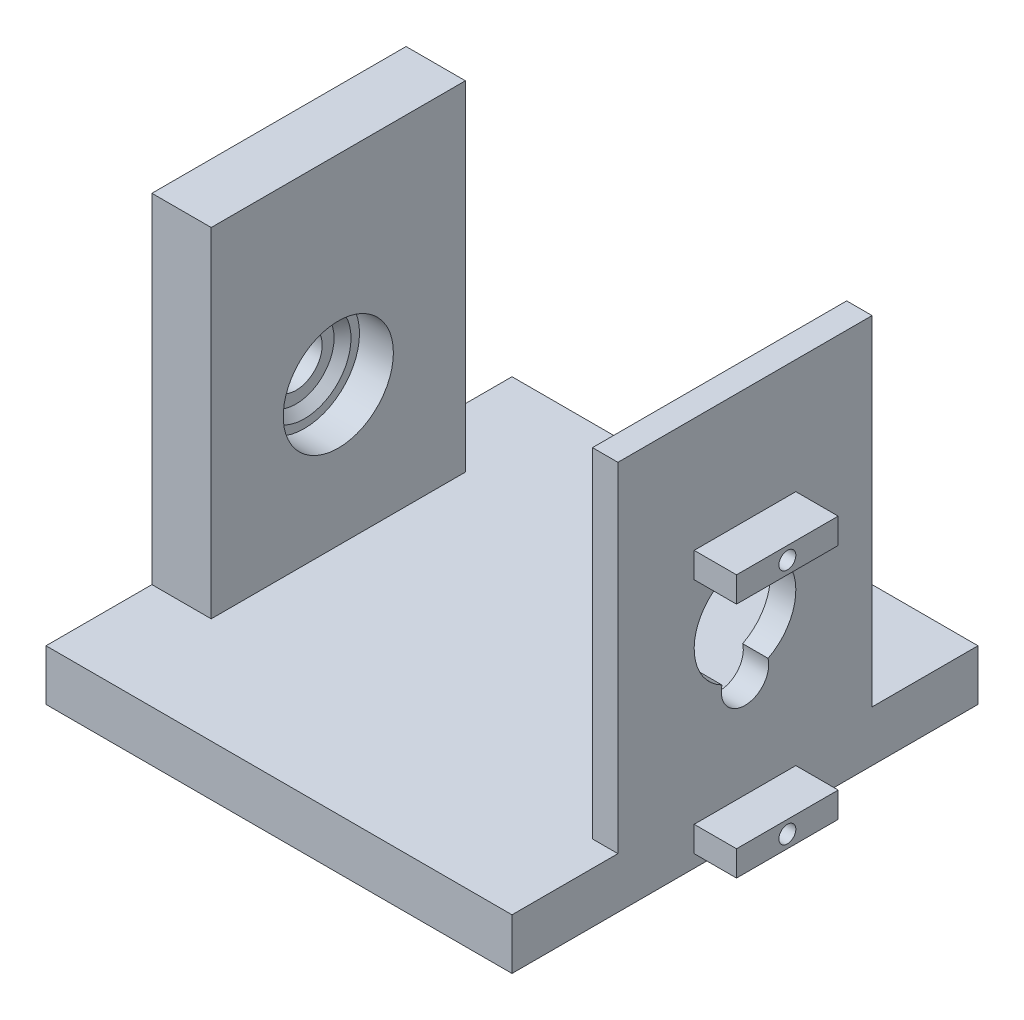
ISO-10303-21;
HEADER;
FILE_DESCRIPTION(('STEP AP214'),'2;1');
FILE_NAME('part.step','',(''),(''),'','','');
FILE_SCHEMA(('AUTOMOTIVE_DESIGN { 1 0 10303 214 1 1 1 1 }'));
ENDSEC;
DATA;
#1=APPLICATION_CONTEXT('core data for automotive mechanical design processes');
#2=APPLICATION_PROTOCOL_DEFINITION('international standard','automotive_design',2000,#1);
#3=PRODUCT_CONTEXT('',#1,'mechanical');
#4=PRODUCT('Part','Part','',(#3));
#5=PRODUCT_RELATED_PRODUCT_CATEGORY('part','',(#4));
#6=PRODUCT_DEFINITION_FORMATION('','',#4);
#7=PRODUCT_DEFINITION_CONTEXT('part definition',#1,'design');
#8=PRODUCT_DEFINITION('design','',#6,#7);
#9=PRODUCT_DEFINITION_SHAPE('','',#8);
#10=(LENGTH_UNIT() NAMED_UNIT(*) SI_UNIT(.MILLI.,.METRE.));
#11=(NAMED_UNIT(*) PLANE_ANGLE_UNIT() SI_UNIT($,.RADIAN.));
#12=(NAMED_UNIT(*) SI_UNIT($,.STERADIAN.) SOLID_ANGLE_UNIT());
#13=UNCERTAINTY_MEASURE_WITH_UNIT(LENGTH_MEASURE(1.E-05),#10,'distance_accuracy_value','');
#14=(GEOMETRIC_REPRESENTATION_CONTEXT(3) GLOBAL_UNCERTAINTY_ASSIGNED_CONTEXT((#13)) GLOBAL_UNIT_ASSIGNED_CONTEXT((#10,
#11,#12)) REPRESENTATION_CONTEXT('',''));
#15=CARTESIAN_POINT('',(0.,0.,0.));
#16=DIRECTION('',(0.,0.,1.));
#17=DIRECTION('',(1.,0.,0.));
#18=AXIS2_PLACEMENT_3D('',#15,#16,#17);
#19=CARTESIAN_POINT('',(-27.501,22.45,0.));
#20=DIRECTION('',(1.,0.,0.));
#21=DIRECTION('',(0.,0.,-1.));
#22=AXIS2_PLACEMENT_3D('',#19,#20,#21);
#23=CYLINDRICAL_SURFACE('',#22,3.1);
#24=CARTESIAN_POINT('',(-27.5,22.45,0.));
#25=DIRECTION('',(-1.,0.,0.));
#26=DIRECTION('',(0.,0.,1.));
#27=AXIS2_PLACEMENT_3D('',#24,#25,#26);
#28=CIRCLE('',#27,3.1);
#29=CARTESIAN_POINT('',(-27.5,22.45,-3.1));
#30=VERTEX_POINT('',#29);
#31=EDGE_CURVE('E219',#30,#30,#28,.F.);
#32=CARTESIAN_POINT('',(-25.5,22.45,0.));
#33=DIRECTION('',(1.,0.,0.));
#34=DIRECTION('',(0.,0.,-1.));
#35=AXIS2_PLACEMENT_3D('',#32,#33,#34);
#36=CIRCLE('',#35,3.1);
#37=CARTESIAN_POINT('',(-25.5,22.45,-3.1));
#38=VERTEX_POINT('',#37);
#39=EDGE_CURVE('E709',#38,#38,#36,.F.);
#40=CARTESIAN_POINT('',(-27.5,22.45,-3.1));
#41=CARTESIAN_POINT('',(-27.4791666666667,22.45,-3.1));
#42=CARTESIAN_POINT('',(-27.4583333333333,22.45,-3.1));
#43=CARTESIAN_POINT('',(-27.4166666666667,22.45,-3.1));
#44=CARTESIAN_POINT('',(-27.3958333333333,22.45,-3.1));
#45=CARTESIAN_POINT('',(-27.3541666666667,22.45,-3.1));
#46=CARTESIAN_POINT('',(-27.3333333333333,22.45,-3.1));
#47=CARTESIAN_POINT('',(-27.2916666666667,22.45,-3.1));
#48=CARTESIAN_POINT('',(-27.2708333333333,22.45,-3.1));
#49=CARTESIAN_POINT('',(-27.2291666666667,22.45,-3.1));
#50=CARTESIAN_POINT('',(-27.2083333333333,22.45,-3.1));
#51=CARTESIAN_POINT('',(-27.1666666666667,22.45,-3.1));
#52=CARTESIAN_POINT('',(-27.1458333333333,22.45,-3.1));
#53=CARTESIAN_POINT('',(-27.1041666666667,22.45,-3.1));
#54=CARTESIAN_POINT('',(-27.0833333333333,22.45,-3.1));
#55=CARTESIAN_POINT('',(-27.0416666666667,22.45,-3.1));
#56=CARTESIAN_POINT('',(-27.0208333333333,22.45,-3.1));
#57=CARTESIAN_POINT('',(-26.9791666666667,22.45,-3.1));
#58=CARTESIAN_POINT('',(-26.9583333333333,22.45,-3.1));
#59=CARTESIAN_POINT('',(-26.9166666666667,22.45,-3.1));
#60=CARTESIAN_POINT('',(-26.8958333333333,22.45,-3.1));
#61=CARTESIAN_POINT('',(-26.8541666666667,22.45,-3.1));
#62=CARTESIAN_POINT('',(-26.8333333333333,22.45,-3.1));
#63=CARTESIAN_POINT('',(-26.7916666666667,22.45,-3.1));
#64=CARTESIAN_POINT('',(-26.7708333333333,22.45,-3.1));
#65=CARTESIAN_POINT('',(-26.7291666666667,22.45,-3.1));
#66=CARTESIAN_POINT('',(-26.7083333333333,22.45,-3.1));
#67=CARTESIAN_POINT('',(-26.6666666666667,22.45,-3.1));
#68=CARTESIAN_POINT('',(-26.6458333333333,22.45,-3.1));
#69=CARTESIAN_POINT('',(-26.6041666666667,22.45,-3.1));
#70=CARTESIAN_POINT('',(-26.5833333333333,22.45,-3.1));
#71=CARTESIAN_POINT('',(-26.5416666666667,22.45,-3.1));
#72=CARTESIAN_POINT('',(-26.5208333333333,22.45,-3.1));
#73=CARTESIAN_POINT('',(-26.4791666666667,22.45,-3.1));
#74=CARTESIAN_POINT('',(-26.4583333333333,22.45,-3.1));
#75=CARTESIAN_POINT('',(-26.4166666666667,22.45,-3.1));
#76=CARTESIAN_POINT('',(-26.3958333333333,22.45,-3.1));
#77=CARTESIAN_POINT('',(-26.3541666666667,22.45,-3.1));
#78=CARTESIAN_POINT('',(-26.3333333333333,22.45,-3.1));
#79=CARTESIAN_POINT('',(-26.2916666666667,22.45,-3.1));
#80=CARTESIAN_POINT('',(-26.2708333333333,22.45,-3.1));
#81=CARTESIAN_POINT('',(-26.2291666666667,22.45,-3.1));
#82=CARTESIAN_POINT('',(-26.2083333333333,22.45,-3.1));
#83=CARTESIAN_POINT('',(-26.1666666666667,22.45,-3.1));
#84=CARTESIAN_POINT('',(-26.1458333333333,22.45,-3.1));
#85=CARTESIAN_POINT('',(-26.1041666666667,22.45,-3.1));
#86=CARTESIAN_POINT('',(-26.0833333333333,22.45,-3.1));
#87=CARTESIAN_POINT('',(-26.0416666666667,22.45,-3.1));
#88=CARTESIAN_POINT('',(-26.0208333333333,22.45,-3.1));
#89=CARTESIAN_POINT('',(-25.9791666666667,22.45,-3.1));
#90=CARTESIAN_POINT('',(-25.9583333333333,22.45,-3.1));
#91=CARTESIAN_POINT('',(-25.9166666666667,22.45,-3.1));
#92=CARTESIAN_POINT('',(-25.8958333333333,22.45,-3.1));
#93=CARTESIAN_POINT('',(-25.8541666666667,22.45,-3.1));
#94=CARTESIAN_POINT('',(-25.8333333333333,22.45,-3.1));
#95=CARTESIAN_POINT('',(-25.7916666666667,22.45,-3.1));
#96=CARTESIAN_POINT('',(-25.7708333333333,22.45,-3.1));
#97=CARTESIAN_POINT('',(-25.7291666666667,22.45,-3.1));
#98=CARTESIAN_POINT('',(-25.7083333333333,22.45,-3.1));
#99=CARTESIAN_POINT('',(-25.6666666666667,22.45,-3.1));
#100=CARTESIAN_POINT('',(-25.6458333333333,22.45,-3.1));
#101=CARTESIAN_POINT('',(-25.6041666666667,22.45,-3.1));
#102=CARTESIAN_POINT('',(-25.5833333333333,22.45,-3.1));
#103=CARTESIAN_POINT('',(-25.5416666666667,22.45,-3.1));
#104=CARTESIAN_POINT('',(-25.5208333333333,22.45,-3.1));
#105=CARTESIAN_POINT('',(-25.5,22.45,-3.1));
#106=B_SPLINE_CURVE_WITH_KNOTS('',3,(#40,#41,#42,#43,#44,#45,#46,#47,#48,#49,#50,#51,#52,#53,
#54,#55,#56,#57,#58,#59,#60,#61,#62,#63,#64,#65,#66,#67,#68,#69,#70,#71,#72,#73,#74,#75,#76,#77,
#78,#79,#80,#81,#82,#83,#84,#85,#86,#87,#88,#89,#90,#91,#92,#93,#94,#95,#96,#97,#98,#99,#100,
#101,#102,#103,#104,#105),.UNSPECIFIED.,.F.,.F.,(4,2,2,2,2,2,2,2,2,2,2,2,2,2,2,2,2,2,2,2,2,2,2,
2,2,2,2,2,2,2,2,2,4),(0.,0.0625000000000001,0.125,0.1875,0.25,0.3125,0.375,0.4375,0.5,0.5625,
0.625000000000001,0.687500000000001,0.750000000000001,0.812500000000001,0.875000000000001,
0.937500000000001,0.999999999999997,1.0625,1.125,1.1875,1.25,1.3125,1.375,1.4375,1.5,1.5625,
1.625,1.6875,1.75,1.8125,1.875,1.9375,1.99999999999999),.UNSPECIFIED.);
#107=EDGE_CURVE('BSEAM51',#30,#38,#106,.T.);
#108=ORIENTED_EDGE('',*,*,#31,.F.);
#109=ORIENTED_EDGE('',*,*,#39,.F.);
#110=ORIENTED_EDGE('',*,*,#107,.T.);
#111=ORIENTED_EDGE('',*,*,#107,.F.);
#112=EDGE_LOOP('',(#108,#110,#109,#111));
#113=FACE_BOUND('',#112,.T.);
#114=ADVANCED_FACE('F51',(#113),#23,.F.);
#115=CARTESIAN_POINT('',(27.5,6.,0.));
#116=DIRECTION('',(-1.,0.,0.));
#117=DIRECTION('',(0.,0.,1.));
#118=AXIS2_PLACEMENT_3D('',#115,#116,#117);
#119=PLANE('',#118);
#120=CARTESIAN_POINT('',(27.5,16.45,0.));
#121=DIRECTION('',(1.,0.,0.));
#122=DIRECTION('',(0.,0.,-1.));
#123=AXIS2_PLACEMENT_3D('',#120,#121,#122);
#124=CIRCLE('',#123,2.8);
#125=CARTESIAN_POINT('',(27.5,17.1033333333333,2.72271106721877));
#126=VERTEX_POINT('',#125);
#127=CARTESIAN_POINT('',(27.5,17.1033333333333,-2.72271106721877));
#128=VERTEX_POINT('',#127);
#129=EDGE_CURVE('E206',#126,#128,#124,.T.);
#130=ORIENTED_EDGE('',*,*,#129,.F.);
#131=CARTESIAN_POINT('',(27.5,22.45,0.));
#132=DIRECTION('',(1.,0.,0.));
#133=DIRECTION('',(0.,0.,-1.));
#134=AXIS2_PLACEMENT_3D('',#131,#132,#133);
#135=CIRCLE('',#134,6.);
#136=EDGE_CURVE('E70',#128,#126,#135,.T.);
#137=ORIENTED_EDGE('',*,*,#136,.F.);
#138=EDGE_LOOP('',(#130,#137));
#139=FACE_BOUND('',#138,.T.);
#140=DIRECTION('',(0.,0.,-1.));
#141=VECTOR('',#140,1.);
#142=CARTESIAN_POINT('',(27.5,29.5,0.));
#143=LINE('',#142,#141);
#144=CARTESIAN_POINT('',(27.5,29.5,6.));
#145=VERTEX_POINT('',#144);
#146=CARTESIAN_POINT('',(27.5,29.5,-6.));
#147=VERTEX_POINT('',#146);
#148=EDGE_CURVE('E302',#145,#147,#143,.T.);
#149=ORIENTED_EDGE('',*,*,#148,.F.);
#150=DIRECTION('',(0.,-1.,0.));
#151=VECTOR('',#150,1.);
#152=CARTESIAN_POINT('',(27.5,0.,5.99999999999998));
#153=LINE('',#152,#151);
#154=CARTESIAN_POINT('',(27.5,32.5,6.));
#155=VERTEX_POINT('',#154);
#156=EDGE_CURVE('E287',#155,#145,#153,.T.);
#157=ORIENTED_EDGE('',*,*,#156,.F.);
#158=DIRECTION('',(0.,0.,-1.));
#159=VECTOR('',#158,1.);
#160=CARTESIAN_POINT('',(27.5,32.5,0.));
#161=LINE('',#160,#159);
#162=CARTESIAN_POINT('',(27.5,32.5,-6.));
#163=VERTEX_POINT('',#162);
#164=EDGE_CURVE('E311',#155,#163,#161,.T.);
#165=ORIENTED_EDGE('',*,*,#164,.T.);
#166=DIRECTION('',(0.,-1.,0.));
#167=VECTOR('',#166,1.);
#168=CARTESIAN_POINT('',(27.5,0.,-6.00000000000002));
#169=LINE('',#168,#167);
#170=EDGE_CURVE('E310',#163,#147,#169,.T.);
#171=ORIENTED_EDGE('',*,*,#170,.T.);
#172=EDGE_LOOP('',(#149,#157,#165,#171));
#173=FACE_BOUND('',#172,.T.);
#174=DIRECTION('',(0.,0.,-1.));
#175=VECTOR('',#174,1.);
#176=CARTESIAN_POINT('',(27.5,0.,0.));
#177=LINE('',#176,#175);
#178=CARTESIAN_POINT('',(27.5,0.,27.5));
#179=VERTEX_POINT('',#178);
#180=CARTESIAN_POINT('',(27.5,0.,-27.5));
#181=VERTEX_POINT('',#180);
#182=EDGE_CURVE('E440',#179,#181,#177,.T.);
#183=ORIENTED_EDGE('',*,*,#182,.T.);
#184=DIRECTION('',(0.,-1.,0.));
#185=VECTOR('',#184,1.);
#186=CARTESIAN_POINT('',(27.5,6.,-27.5));
#187=LINE('',#186,#185);
#188=CARTESIAN_POINT('',(27.5,6.,-27.5));
#189=VERTEX_POINT('',#188);
#190=EDGE_CURVE('E455',#189,#181,#187,.T.);
#191=ORIENTED_EDGE('',*,*,#190,.F.);
#192=DIRECTION('',(0.,0.,-1.));
#193=VECTOR('',#192,1.);
#194=CARTESIAN_POINT('',(27.5,6.,0.));
#195=LINE('',#194,#193);
#196=CARTESIAN_POINT('',(27.5,6.,-15.));
#197=VERTEX_POINT('',#196);
#198=EDGE_CURVE('E419',#197,#189,#195,.T.);
#199=ORIENTED_EDGE('',*,*,#198,.F.);
#200=DIRECTION('',(0.,-1.,0.));
#201=VECTOR('',#200,1.);
#202=CARTESIAN_POINT('',(27.5,46.,-15.));
#203=LINE('',#202,#201);
#204=CARTESIAN_POINT('',(27.5,46.,-15.));
#205=VERTEX_POINT('',#204);
#206=EDGE_CURVE('E277',#205,#197,#203,.T.);
#207=ORIENTED_EDGE('',*,*,#206,.F.);
#208=DIRECTION('',(0.,0.,-1.));
#209=VECTOR('',#208,1.);
#210=CARTESIAN_POINT('',(27.5,46.,-15.));
#211=LINE('',#210,#209);
#212=CARTESIAN_POINT('',(27.5,46.,15.));
#213=VERTEX_POINT('',#212);
#214=EDGE_CURVE('E395',#213,#205,#211,.T.);
#215=ORIENTED_EDGE('',*,*,#214,.F.);
#216=DIRECTION('',(0.,-1.,0.));
#217=VECTOR('',#216,1.);
#218=CARTESIAN_POINT('',(27.5,46.,15.));
#219=LINE('',#218,#217);
#220=CARTESIAN_POINT('',(27.5,6.,15.));
#221=VERTEX_POINT('',#220);
#222=EDGE_CURVE('E384',#213,#221,#219,.T.);
#223=ORIENTED_EDGE('',*,*,#222,.T.);
#224=CARTESIAN_POINT('',(27.5,6.,27.5));
#225=VERTEX_POINT('',#224);
#226=EDGE_CURVE('E423',#225,#221,#195,.T.);
#227=ORIENTED_EDGE('',*,*,#226,.F.);
#228=DIRECTION('',(0.,-1.,0.));
#229=VECTOR('',#228,1.);
#230=CARTESIAN_POINT('',(27.5,6.,27.5));
#231=LINE('',#230,#229);
#232=EDGE_CURVE('E459',#225,#179,#231,.T.);
#233=ORIENTED_EDGE('',*,*,#232,.T.);
#234=EDGE_LOOP('',(#183,#191,#199,#207,#215,#223,#227,#233));
#235=FACE_BOUND('',#234,.T.);
#236=DIRECTION('',(0.,-1.,0.));
#237=VECTOR('',#236,1.);
#238=CARTESIAN_POINT('',(27.5,0.,6.));
#239=LINE('',#238,#237);
#240=CARTESIAN_POINT('',(27.5,4.5,6.));
#241=VERTEX_POINT('',#240);
#242=CARTESIAN_POINT('',(27.5,1.5,6.));
#243=VERTEX_POINT('',#242);
#244=EDGE_CURVE('E252',#241,#243,#239,.T.);
#245=ORIENTED_EDGE('',*,*,#244,.F.);
#246=DIRECTION('',(0.,0.,-1.));
#247=VECTOR('',#246,1.);
#248=CARTESIAN_POINT('',(27.5,4.5,0.));
#249=LINE('',#248,#247);
#250=CARTESIAN_POINT('',(27.5,4.5,-6.));
#251=VERTEX_POINT('',#250);
#252=EDGE_CURVE('E233',#241,#251,#249,.T.);
#253=ORIENTED_EDGE('',*,*,#252,.T.);
#254=DIRECTION('',(0.,-1.,0.));
#255=VECTOR('',#254,1.);
#256=CARTESIAN_POINT('',(27.5,0.,-6.));
#257=LINE('',#256,#255);
#258=CARTESIAN_POINT('',(27.5,1.5,-6.));
#259=VERTEX_POINT('',#258);
#260=EDGE_CURVE('E257',#251,#259,#257,.T.);
#261=ORIENTED_EDGE('',*,*,#260,.T.);
#262=DIRECTION('',(0.,0.,-1.));
#263=VECTOR('',#262,1.);
#264=CARTESIAN_POINT('',(27.5,1.5,0.));
#265=LINE('',#264,#263);
#266=EDGE_CURVE('E259',#243,#259,#265,.T.);
#267=ORIENTED_EDGE('',*,*,#266,.F.);
#268=EDGE_LOOP('',(#245,#253,#261,#267));
#269=FACE_BOUND('',#268,.T.);
#270=ADVANCED_FACE('F215',(#139,#173,#235,#269),#119,.F.);
#271=CARTESIAN_POINT('',(0.,6.,27.5));
#272=DIRECTION('',(0.,0.,-1.));
#273=DIRECTION('',(-1.,0.,0.));
#274=AXIS2_PLACEMENT_3D('',#271,#272,#273);
#275=PLANE('',#274);
#276=DIRECTION('',(1.,0.,0.));
#277=VECTOR('',#276,1.);
#278=CARTESIAN_POINT('',(0.,0.,27.5));
#279=LINE('',#278,#277);
#280=CARTESIAN_POINT('',(-27.5,0.,27.5));
#281=VERTEX_POINT('',#280);
#282=EDGE_CURVE('E413',#281,#179,#279,.T.);
#283=ORIENTED_EDGE('',*,*,#282,.T.);
#284=ORIENTED_EDGE('',*,*,#232,.F.);
#285=DIRECTION('',(1.,0.,0.));
#286=VECTOR('',#285,1.);
#287=CARTESIAN_POINT('',(0.,6.,27.5));
#288=LINE('',#287,#286);
#289=CARTESIAN_POINT('',(-27.5,6.,27.5));
#290=VERTEX_POINT('',#289);
#291=EDGE_CURVE('E412',#290,#225,#288,.T.);
#292=ORIENTED_EDGE('',*,*,#291,.F.);
#293=DIRECTION('',(0.,-1.,0.));
#294=VECTOR('',#293,1.);
#295=CARTESIAN_POINT('',(-27.5,6.,27.5));
#296=LINE('',#295,#294);
#297=EDGE_CURVE('E433',#290,#281,#296,.T.);
#298=ORIENTED_EDGE('',*,*,#297,.T.);
#299=EDGE_LOOP('',(#283,#284,#292,#298));
#300=FACE_BOUND('',#299,.T.);
#301=ADVANCED_FACE('F513',(#300),#275,.F.);
#302=CARTESIAN_POINT('',(0.,6.,-27.5));
#303=DIRECTION('',(0.,0.,-1.));
#304=DIRECTION('',(-1.,0.,0.));
#305=AXIS2_PLACEMENT_3D('',#302,#303,#304);
#306=PLANE('',#305);
#307=DIRECTION('',(1.,0.,0.));
#308=VECTOR('',#307,1.);
#309=CARTESIAN_POINT('',(0.,0.,-27.5));
#310=LINE('',#309,#308);
#311=CARTESIAN_POINT('',(-27.5,0.,-27.5));
#312=VERTEX_POINT('',#311);
#313=EDGE_CURVE('E441',#312,#181,#310,.T.);
#314=ORIENTED_EDGE('',*,*,#313,.F.);
#315=DIRECTION('',(0.,-1.,0.));
#316=VECTOR('',#315,1.);
#317=CARTESIAN_POINT('',(-27.5,6.,-27.5));
#318=LINE('',#317,#316);
#319=CARTESIAN_POINT('',(-27.5,6.,-27.5));
#320=VERTEX_POINT('',#319);
#321=EDGE_CURVE('E448',#320,#312,#318,.T.);
#322=ORIENTED_EDGE('',*,*,#321,.F.);
#323=DIRECTION('',(1.,0.,0.));
#324=VECTOR('',#323,1.);
#325=CARTESIAN_POINT('',(0.,6.,-27.5));
#326=LINE('',#325,#324);
#327=EDGE_CURVE('E425',#320,#189,#326,.T.);
#328=ORIENTED_EDGE('',*,*,#327,.T.);
#329=ORIENTED_EDGE('',*,*,#190,.T.);
#330=EDGE_LOOP('',(#314,#322,#328,#329));
#331=FACE_BOUND('',#330,.T.);
#332=ADVANCED_FACE('F506',(#331),#306,.T.);
#333=CARTESIAN_POINT('',(-27.5,6.,0.));
#334=DIRECTION('',(-1.,0.,0.));
#335=DIRECTION('',(0.,0.,1.));
#336=AXIS2_PLACEMENT_3D('',#333,#334,#335);
#337=PLANE('',#336);
#338=ORIENTED_EDGE('',*,*,#31,.T.);
#339=EDGE_LOOP('',(#338));
#340=FACE_BOUND('',#339,.T.);
#341=DIRECTION('',(0.,0.,-1.));
#342=VECTOR('',#341,1.);
#343=CARTESIAN_POINT('',(-27.5,0.,0.));
#344=LINE('',#343,#342);
#345=EDGE_CURVE('E416',#281,#312,#344,.T.);
#346=ORIENTED_EDGE('',*,*,#345,.F.);
#347=ORIENTED_EDGE('',*,*,#297,.F.);
#348=DIRECTION('',(0.,0.,-1.));
#349=VECTOR('',#348,1.);
#350=CARTESIAN_POINT('',(-27.5,6.,0.));
#351=LINE('',#350,#349);
#352=CARTESIAN_POINT('',(-27.5,6.,15.));
#353=VERTEX_POINT('',#352);
#354=EDGE_CURVE('E429',#290,#353,#351,.T.);
#355=ORIENTED_EDGE('',*,*,#354,.T.);
#356=DIRECTION('',(0.,-1.,0.));
#357=VECTOR('',#356,1.);
#358=CARTESIAN_POINT('',(-27.5,46.,15.));
#359=LINE('',#358,#357);
#360=CARTESIAN_POINT('',(-27.5,46.,15.));
#361=VERTEX_POINT('',#360);
#362=EDGE_CURVE('E370',#361,#353,#359,.T.);
#363=ORIENTED_EDGE('',*,*,#362,.F.);
#364=DIRECTION('',(0.,0.,1.));
#365=VECTOR('',#364,1.);
#366=CARTESIAN_POINT('',(-27.5,46.,-15.));
#367=LINE('',#366,#365);
#368=CARTESIAN_POINT('',(-27.5,46.,-15.));
#369=VERTEX_POINT('',#368);
#370=EDGE_CURVE('E328',#369,#361,#367,.T.);
#371=ORIENTED_EDGE('',*,*,#370,.F.);
#372=DIRECTION('',(0.,-1.,0.));
#373=VECTOR('',#372,1.);
#374=CARTESIAN_POINT('',(-27.5,46.,-15.));
#375=LINE('',#374,#373);
#376=CARTESIAN_POINT('',(-27.5,6.,-15.));
#377=VERTEX_POINT('',#376);
#378=EDGE_CURVE('E345',#369,#377,#375,.T.);
#379=ORIENTED_EDGE('',*,*,#378,.T.);
#380=EDGE_CURVE('E426',#377,#320,#351,.T.);
#381=ORIENTED_EDGE('',*,*,#380,.T.);
#382=ORIENTED_EDGE('',*,*,#321,.T.);
#383=EDGE_LOOP('',(#346,#347,#355,#363,#371,#379,#381,#382));
#384=FACE_BOUND('',#383,.T.);
#385=ADVANCED_FACE('F501',(#340,#384),#337,.T.);
#386=CARTESIAN_POINT('',(0.,6.,0.));
#387=DIRECTION('',(0.,1.,0.));
#388=DIRECTION('',(0.,0.,1.));
#389=AXIS2_PLACEMENT_3D('',#386,#387,#388);
#390=PLANE('',#389);
#391=DIRECTION('',(-1.,0.,0.));
#392=VECTOR('',#391,1.);
#393=CARTESIAN_POINT('',(-27.5,6.,-15.));
#394=LINE('',#393,#392);
#395=CARTESIAN_POINT('',(-20.5,6.,-15.));
#396=VERTEX_POINT('',#395);
#397=EDGE_CURVE('E334',#396,#377,#394,.T.);
#398=ORIENTED_EDGE('',*,*,#397,.F.);
#399=DIRECTION('',(0.,0.,-1.));
#400=VECTOR('',#399,1.);
#401=CARTESIAN_POINT('',(-20.5,6.,-15.));
#402=LINE('',#401,#400);
#403=CARTESIAN_POINT('',(-20.5,6.,15.));
#404=VERTEX_POINT('',#403);
#405=EDGE_CURVE('E350',#404,#396,#402,.T.);
#406=ORIENTED_EDGE('',*,*,#405,.F.);
#407=DIRECTION('',(1.,0.,0.));
#408=VECTOR('',#407,1.);
#409=CARTESIAN_POINT('',(-27.5,6.,15.));
#410=LINE('',#409,#408);
#411=EDGE_CURVE('E343',#353,#404,#410,.T.);
#412=ORIENTED_EDGE('',*,*,#411,.F.);
#413=ORIENTED_EDGE('',*,*,#354,.F.);
#414=ORIENTED_EDGE('',*,*,#291,.T.);
#415=ORIENTED_EDGE('',*,*,#226,.T.);
#416=DIRECTION('',(1.,0.,0.));
#417=VECTOR('',#416,1.);
#418=CARTESIAN_POINT('',(27.5,6.,15.));
#419=LINE('',#418,#417);
#420=CARTESIAN_POINT('',(24.5,6.,15.));
#421=VERTEX_POINT('',#420);
#422=EDGE_CURVE('E390',#421,#221,#419,.T.);
#423=ORIENTED_EDGE('',*,*,#422,.F.);
#424=DIRECTION('',(0.,0.,1.));
#425=VECTOR('',#424,1.);
#426=CARTESIAN_POINT('',(24.5,6.,-15.));
#427=LINE('',#426,#425);
#428=CARTESIAN_POINT('',(24.5,6.,-15.));
#429=VERTEX_POINT('',#428);
#430=EDGE_CURVE('E391',#429,#421,#427,.T.);
#431=ORIENTED_EDGE('',*,*,#430,.F.);
#432=DIRECTION('',(-1.,0.,0.));
#433=VECTOR('',#432,1.);
#434=CARTESIAN_POINT('',(27.5,6.,-15.));
#435=LINE('',#434,#433);
#436=EDGE_CURVE('E348',#197,#429,#435,.T.);
#437=ORIENTED_EDGE('',*,*,#436,.F.);
#438=ORIENTED_EDGE('',*,*,#198,.T.);
#439=ORIENTED_EDGE('',*,*,#327,.F.);
#440=ORIENTED_EDGE('',*,*,#380,.F.);
#441=EDGE_LOOP('',(#398,#406,#412,#413,#414,#415,#423,#431,#437,#438,#439,#440));
#442=FACE_BOUND('',#441,.T.);
#443=ADVANCED_FACE('F493',(#442),#390,.T.);
#444=CARTESIAN_POINT('',(0.,0.,0.));
#445=DIRECTION('',(0.,1.,0.));
#446=DIRECTION('',(0.,0.,1.));
#447=AXIS2_PLACEMENT_3D('',#444,#445,#446);
#448=PLANE('',#447);
#449=CARTESIAN_POINT('',(0.,0.,0.));
#450=DIRECTION('',(0.,1.,0.));
#451=DIRECTION('',(0.,0.,1.));
#452=AXIS2_PLACEMENT_3D('',#449,#450,#451);
#453=CIRCLE('',#452,22.);
#454=CARTESIAN_POINT('',(0.,0.,22.));
#455=VERTEX_POINT('',#454);
#456=EDGE_CURVE('E371',#455,#455,#453,.T.);
#457=ORIENTED_EDGE('',*,*,#456,.T.);
#458=EDGE_LOOP('',(#457));
#459=FACE_BOUND('',#458,.T.);
#460=ORIENTED_EDGE('',*,*,#282,.F.);
#461=ORIENTED_EDGE('',*,*,#345,.T.);
#462=ORIENTED_EDGE('',*,*,#313,.T.);
#463=ORIENTED_EDGE('',*,*,#182,.F.);
#464=EDGE_LOOP('',(#460,#461,#462,#463));
#465=FACE_BOUND('',#464,.T.);
#466=ADVANCED_FACE('F508',(#459,#465),#448,.F.);
#467=CARTESIAN_POINT('',(0.,3.,0.));
#468=DIRECTION('',(0.,-1.,0.));
#469=DIRECTION('',(0.,0.,-1.));
#470=AXIS2_PLACEMENT_3D('',#467,#468,#469);
#471=CYLINDRICAL_SURFACE('',#470,22.);
#472=CARTESIAN_POINT('',(0.,2.5,0.));
#473=DIRECTION('',(0.,1.,0.));
#474=DIRECTION('',(0.,0.,1.));
#475=AXIS2_PLACEMENT_3D('',#472,#473,#474);
#476=CIRCLE('',#475,22.);
#477=CARTESIAN_POINT('',(0.,2.5,22.));
#478=VERTEX_POINT('',#477);
#479=EDGE_CURVE('E457',#478,#478,#476,.T.);
#480=ORIENTED_EDGE('',*,*,#479,.T.);
#481=EDGE_LOOP('',(#480));
#482=FACE_BOUND('',#481,.T.);
#483=ORIENTED_EDGE('',*,*,#456,.F.);
#484=EDGE_LOOP('',(#483));
#485=FACE_BOUND('',#484,.T.);
#486=ADVANCED_FACE('F843',(#482,#485),#471,.F.);
#487=CARTESIAN_POINT('',(0.,3.,0.));
#488=DIRECTION('',(0.,1.,0.));
#489=DIRECTION('',(0.,0.,1.));
#490=AXIS2_PLACEMENT_3D('',#487,#488,#489);
#491=PLANE('',#490);
#492=CARTESIAN_POINT('',(0.,3.,0.));
#493=DIRECTION('',(0.,1.,0.));
#494=DIRECTION('',(0.,0.,1.));
#495=AXIS2_PLACEMENT_3D('',#492,#493,#494);
#496=CIRCLE('',#495,21.5);
#497=CARTESIAN_POINT('',(0.,3.,21.5));
#498=VERTEX_POINT('',#497);
#499=EDGE_CURVE('E464',#498,#498,#496,.F.);
#500=ORIENTED_EDGE('',*,*,#499,.T.);
#501=EDGE_LOOP('',(#500));
#502=FACE_BOUND('',#501,.T.);
#503=ADVANCED_FACE('F837',(#502),#491,.F.);
#504=CARTESIAN_POINT('',(0.,2.5,0.));
#505=DIRECTION('',(0.,1.,0.));
#506=DIRECTION('',(0.,0.,1.));
#507=AXIS2_PLACEMENT_3D('',#504,#505,#506);
#508=TOROIDAL_SURFACE('',#507,21.5,0.5);
#509=ORIENTED_EDGE('',*,*,#499,.F.);
#510=EDGE_LOOP('',(#509));
#511=FACE_BOUND('',#510,.T.);
#512=ORIENTED_EDGE('',*,*,#479,.F.);
#513=EDGE_LOOP('',(#512));
#514=FACE_BOUND('',#513,.T.);
#515=ADVANCED_FACE('F828',(#511,#514),#508,.F.);
#516=CARTESIAN_POINT('',(27.5,46.,-15.));
#517=DIRECTION('',(0.,0.,1.));
#518=DIRECTION('',(1.,0.,0.));
#519=AXIS2_PLACEMENT_3D('',#516,#517,#518);
#520=PLANE('',#519);
#521=ORIENTED_EDGE('',*,*,#436,.T.);
#522=DIRECTION('',(0.,-1.,0.));
#523=VECTOR('',#522,1.);
#524=CARTESIAN_POINT('',(24.5,46.,-15.));
#525=LINE('',#524,#523);
#526=CARTESIAN_POINT('',(24.5,46.,-15.));
#527=VERTEX_POINT('',#526);
#528=EDGE_CURVE('E374',#527,#429,#525,.T.);
#529=ORIENTED_EDGE('',*,*,#528,.F.);
#530=DIRECTION('',(-1.,0.,0.));
#531=VECTOR('',#530,1.);
#532=CARTESIAN_POINT('',(27.5,46.,-15.));
#533=LINE('',#532,#531);
#534=EDGE_CURVE('E403',#205,#527,#533,.T.);
#535=ORIENTED_EDGE('',*,*,#534,.F.);
#536=ORIENTED_EDGE('',*,*,#206,.T.);
#537=EDGE_LOOP('',(#521,#529,#535,#536));
#538=FACE_BOUND('',#537,.T.);
#539=ADVANCED_FACE('F479',(#538),#520,.F.);
#540=CARTESIAN_POINT('',(24.5,46.,-15.));
#541=DIRECTION('',(1.,0.,0.));
#542=DIRECTION('',(0.,0.,-1.));
#543=AXIS2_PLACEMENT_3D('',#540,#541,#542);
#544=PLANE('',#543);
#545=CARTESIAN_POINT('',(24.5,16.45,0.));
#546=DIRECTION('',(1.,0.,0.));
#547=DIRECTION('',(0.,0.,-1.));
#548=AXIS2_PLACEMENT_3D('',#545,#546,#547);
#549=CIRCLE('',#548,2.8);
#550=CARTESIAN_POINT('',(24.5,17.1033333333333,2.72271106721877));
#551=VERTEX_POINT('',#550);
#552=CARTESIAN_POINT('',(24.5,17.1033333333333,-2.72271106721877));
#553=VERTEX_POINT('',#552);
#554=EDGE_CURVE('E466',#551,#553,#549,.T.);
#555=ORIENTED_EDGE('',*,*,#554,.T.);
#556=CARTESIAN_POINT('',(24.5,22.45,0.));
#557=DIRECTION('',(1.,0.,0.));
#558=DIRECTION('',(0.,0.,-1.));
#559=AXIS2_PLACEMENT_3D('',#556,#557,#558);
#560=CIRCLE('',#559,6.);
#561=EDGE_CURVE('E64',#553,#551,#560,.T.);
#562=ORIENTED_EDGE('',*,*,#561,.T.);
#563=EDGE_LOOP('',(#555,#562));
#564=FACE_BOUND('',#563,.T.);
#565=ORIENTED_EDGE('',*,*,#430,.T.);
#566=DIRECTION('',(0.,-1.,0.));
#567=VECTOR('',#566,1.);
#568=CARTESIAN_POINT('',(24.5,46.,15.));
#569=LINE('',#568,#567);
#570=CARTESIAN_POINT('',(24.5,46.,15.));
#571=VERTEX_POINT('',#570);
#572=EDGE_CURVE('E378',#571,#421,#569,.T.);
#573=ORIENTED_EDGE('',*,*,#572,.F.);
#574=DIRECTION('',(0.,0.,1.));
#575=VECTOR('',#574,1.);
#576=CARTESIAN_POINT('',(24.5,46.,-15.));
#577=LINE('',#576,#575);
#578=EDGE_CURVE('E405',#527,#571,#577,.T.);
#579=ORIENTED_EDGE('',*,*,#578,.F.);
#580=ORIENTED_EDGE('',*,*,#528,.T.);
#581=EDGE_LOOP('',(#565,#573,#579,#580));
#582=FACE_BOUND('',#581,.T.);
#583=ADVANCED_FACE('F471',(#564,#582),#544,.F.);
#584=CARTESIAN_POINT('',(27.5,46.,15.));
#585=DIRECTION('',(0.,0.,-1.));
#586=DIRECTION('',(-1.,0.,0.));
#587=AXIS2_PLACEMENT_3D('',#584,#585,#586);
#588=PLANE('',#587);
#589=ORIENTED_EDGE('',*,*,#422,.T.);
#590=ORIENTED_EDGE('',*,*,#222,.F.);
#591=DIRECTION('',(1.,0.,0.));
#592=VECTOR('',#591,1.);
#593=CARTESIAN_POINT('',(27.5,46.,15.));
#594=LINE('',#593,#592);
#595=EDGE_CURVE('E386',#571,#213,#594,.T.);
#596=ORIENTED_EDGE('',*,*,#595,.F.);
#597=ORIENTED_EDGE('',*,*,#572,.T.);
#598=EDGE_LOOP('',(#589,#590,#596,#597));
#599=FACE_BOUND('',#598,.T.);
#600=ADVANCED_FACE('F472',(#599),#588,.F.);
#601=CARTESIAN_POINT('',(0.,46.,0.));
#602=DIRECTION('',(0.,-1.,0.));
#603=DIRECTION('',(0.,0.,-1.));
#604=AXIS2_PLACEMENT_3D('',#601,#602,#603);
#605=PLANE('',#604);
#606=ORIENTED_EDGE('',*,*,#214,.T.);
#607=ORIENTED_EDGE('',*,*,#534,.T.);
#608=ORIENTED_EDGE('',*,*,#578,.T.);
#609=ORIENTED_EDGE('',*,*,#595,.T.);
#610=EDGE_LOOP('',(#606,#607,#608,#609));
#611=FACE_BOUND('',#610,.T.);
#612=ADVANCED_FACE('F487',(#611),#605,.F.);
#613=CARTESIAN_POINT('',(-27.5,46.,15.));
#614=DIRECTION('',(0.,0.,-1.));
#615=DIRECTION('',(-1.,0.,0.));
#616=AXIS2_PLACEMENT_3D('',#613,#614,#615);
#617=PLANE('',#616);
#618=ORIENTED_EDGE('',*,*,#411,.T.);
#619=DIRECTION('',(0.,-1.,0.));
#620=VECTOR('',#619,1.);
#621=CARTESIAN_POINT('',(-20.5,46.,15.));
#622=LINE('',#621,#620);
#623=CARTESIAN_POINT('',(-20.5,46.,15.));
#624=VERTEX_POINT('',#623);
#625=EDGE_CURVE('E361',#624,#404,#622,.T.);
#626=ORIENTED_EDGE('',*,*,#625,.F.);
#627=DIRECTION('',(1.,0.,0.));
#628=VECTOR('',#627,1.);
#629=CARTESIAN_POINT('',(-27.5,46.,15.));
#630=LINE('',#629,#628);
#631=EDGE_CURVE('E333',#361,#624,#630,.T.);
#632=ORIENTED_EDGE('',*,*,#631,.F.);
#633=ORIENTED_EDGE('',*,*,#362,.T.);
#634=EDGE_LOOP('',(#618,#626,#632,#633));
#635=FACE_BOUND('',#634,.T.);
#636=ADVANCED_FACE('F520',(#635),#617,.F.);
#637=CARTESIAN_POINT('',(-20.5,46.,-15.));
#638=DIRECTION('',(-1.,0.,0.));
#639=DIRECTION('',(0.,0.,1.));
#640=AXIS2_PLACEMENT_3D('',#637,#638,#639);
#641=PLANE('',#640);
#642=CARTESIAN_POINT('',(-20.5,22.45,0.));
#643=DIRECTION('',(1.,0.,0.));
#644=DIRECTION('',(0.,0.,-1.));
#645=AXIS2_PLACEMENT_3D('',#642,#643,#644);
#646=CIRCLE('',#645,6.5);
#647=CARTESIAN_POINT('',(-20.5,22.45,-6.5));
#648=VERTEX_POINT('',#647);
#649=EDGE_CURVE('E708',#648,#648,#646,.T.);
#650=ORIENTED_EDGE('',*,*,#649,.F.);
#651=EDGE_LOOP('',(#650));
#652=FACE_BOUND('',#651,.T.);
#653=ORIENTED_EDGE('',*,*,#405,.T.);
#654=DIRECTION('',(0.,-1.,0.));
#655=VECTOR('',#654,1.);
#656=CARTESIAN_POINT('',(-20.5,46.,-15.));
#657=LINE('',#656,#655);
#658=CARTESIAN_POINT('',(-20.5,46.,-15.));
#659=VERTEX_POINT('',#658);
#660=EDGE_CURVE('E360',#659,#396,#657,.T.);
#661=ORIENTED_EDGE('',*,*,#660,.F.);
#662=DIRECTION('',(0.,0.,-1.));
#663=VECTOR('',#662,1.);
#664=CARTESIAN_POINT('',(-20.5,46.,-15.));
#665=LINE('',#664,#663);
#666=EDGE_CURVE('E340',#624,#659,#665,.T.);
#667=ORIENTED_EDGE('',*,*,#666,.F.);
#668=ORIENTED_EDGE('',*,*,#625,.T.);
#669=EDGE_LOOP('',(#653,#661,#667,#668));
#670=FACE_BOUND('',#669,.T.);
#671=ADVANCED_FACE('F524',(#652,#670),#641,.F.);
#672=CARTESIAN_POINT('',(-27.5,46.,-15.));
#673=DIRECTION('',(0.,0.,1.));
#674=DIRECTION('',(1.,0.,0.));
#675=AXIS2_PLACEMENT_3D('',#672,#673,#674);
#676=PLANE('',#675);
#677=ORIENTED_EDGE('',*,*,#397,.T.);
#678=ORIENTED_EDGE('',*,*,#378,.F.);
#679=DIRECTION('',(-1.,0.,0.));
#680=VECTOR('',#679,1.);
#681=CARTESIAN_POINT('',(-27.5,46.,-15.));
#682=LINE('',#681,#680);
#683=EDGE_CURVE('E338',#659,#369,#682,.T.);
#684=ORIENTED_EDGE('',*,*,#683,.F.);
#685=ORIENTED_EDGE('',*,*,#660,.T.);
#686=EDGE_LOOP('',(#677,#678,#684,#685));
#687=FACE_BOUND('',#686,.T.);
#688=ADVANCED_FACE('F530',(#687),#676,.F.);
#689=CARTESIAN_POINT('',(0.,46.,0.));
#690=DIRECTION('',(0.,1.,0.));
#691=DIRECTION('',(0.,0.,1.));
#692=AXIS2_PLACEMENT_3D('',#689,#690,#691);
#693=PLANE('',#692);
#694=ORIENTED_EDGE('',*,*,#370,.T.);
#695=ORIENTED_EDGE('',*,*,#631,.T.);
#696=ORIENTED_EDGE('',*,*,#666,.T.);
#697=ORIENTED_EDGE('',*,*,#683,.T.);
#698=EDGE_LOOP('',(#694,#695,#696,#697));
#699=FACE_BOUND('',#698,.T.);
#700=ADVANCED_FACE('F522',(#699),#693,.T.);
#701=CARTESIAN_POINT('',(32.5,29.5,0.));
#702=DIRECTION('',(0.,1.,0.));
#703=DIRECTION('',(0.,0.,1.));
#704=AXIS2_PLACEMENT_3D('',#701,#702,#703);
#705=PLANE('',#704);
#706=ORIENTED_EDGE('',*,*,#148,.T.);
#707=DIRECTION('',(-1.,0.,0.));
#708=VECTOR('',#707,1.);
#709=CARTESIAN_POINT('',(32.5,29.5,-6.));
#710=LINE('',#709,#708);
#711=CARTESIAN_POINT('',(32.5,29.5,-6.));
#712=VERTEX_POINT('',#711);
#713=EDGE_CURVE('E255',#712,#147,#710,.T.);
#714=ORIENTED_EDGE('',*,*,#713,.F.);
#715=DIRECTION('',(0.,0.,-1.));
#716=VECTOR('',#715,1.);
#717=CARTESIAN_POINT('',(32.5,29.5,0.));
#718=LINE('',#717,#716);
#719=CARTESIAN_POINT('',(32.5,29.5,6.));
#720=VERTEX_POINT('',#719);
#721=EDGE_CURVE('E282',#720,#712,#718,.T.);
#722=ORIENTED_EDGE('',*,*,#721,.F.);
#723=DIRECTION('',(-1.,0.,0.));
#724=VECTOR('',#723,1.);
#725=CARTESIAN_POINT('',(32.5,29.5,6.));
#726=LINE('',#725,#724);
#727=EDGE_CURVE('E297',#720,#145,#726,.T.);
#728=ORIENTED_EDGE('',*,*,#727,.T.);
#729=EDGE_LOOP('',(#706,#714,#722,#728));
#730=FACE_BOUND('',#729,.T.);
#731=ADVANCED_FACE('F534',(#730),#705,.F.);
#732=CARTESIAN_POINT('',(32.5,0.,-6.00000000000002));
#733=DIRECTION('',(0.,0.,-1.));
#734=DIRECTION('',(0.,1.,0.));
#735=AXIS2_PLACEMENT_3D('',#732,#733,#734);
#736=PLANE('',#735);
#737=ORIENTED_EDGE('',*,*,#170,.F.);
#738=DIRECTION('',(-1.,0.,0.));
#739=VECTOR('',#738,1.);
#740=CARTESIAN_POINT('',(32.5,32.5,-6.));
#741=LINE('',#740,#739);
#742=CARTESIAN_POINT('',(32.5,32.5,-6.));
#743=VERTEX_POINT('',#742);
#744=EDGE_CURVE('E325',#743,#163,#741,.T.);
#745=ORIENTED_EDGE('',*,*,#744,.F.);
#746=DIRECTION('',(0.,-1.,0.));
#747=VECTOR('',#746,1.);
#748=CARTESIAN_POINT('',(32.5,0.,-6.00000000000002));
#749=LINE('',#748,#747);
#750=EDGE_CURVE('E289',#743,#712,#749,.T.);
#751=ORIENTED_EDGE('',*,*,#750,.T.);
#752=ORIENTED_EDGE('',*,*,#713,.T.);
#753=EDGE_LOOP('',(#737,#745,#751,#752));
#754=FACE_BOUND('',#753,.T.);
#755=ADVANCED_FACE('F597',(#754),#736,.T.);
#756=CARTESIAN_POINT('',(32.5,32.5,0.));
#757=DIRECTION('',(0.,1.,0.));
#758=DIRECTION('',(0.,0.,1.));
#759=AXIS2_PLACEMENT_3D('',#756,#757,#758);
#760=PLANE('',#759);
#761=ORIENTED_EDGE('',*,*,#164,.F.);
#762=DIRECTION('',(-1.,0.,0.));
#763=VECTOR('',#762,1.);
#764=CARTESIAN_POINT('',(32.5,32.5,6.));
#765=LINE('',#764,#763);
#766=CARTESIAN_POINT('',(32.5,32.5,6.));
#767=VERTEX_POINT('',#766);
#768=EDGE_CURVE('E318',#767,#155,#765,.T.);
#769=ORIENTED_EDGE('',*,*,#768,.F.);
#770=DIRECTION('',(0.,0.,-1.));
#771=VECTOR('',#770,1.);
#772=CARTESIAN_POINT('',(32.5,32.5,0.));
#773=LINE('',#772,#771);
#774=EDGE_CURVE('E291',#767,#743,#773,.T.);
#775=ORIENTED_EDGE('',*,*,#774,.T.);
#776=ORIENTED_EDGE('',*,*,#744,.T.);
#777=EDGE_LOOP('',(#761,#769,#775,#776));
#778=FACE_BOUND('',#777,.T.);
#779=ADVANCED_FACE('F593',(#778),#760,.T.);
#780=CARTESIAN_POINT('',(32.5,31.,0.));
#781=DIRECTION('',(-1.,0.,0.));
#782=DIRECTION('',(0.,0.,1.));
#783=AXIS2_PLACEMENT_3D('',#780,#781,#782);
#784=CYLINDRICAL_SURFACE('',#783,1.);
#785=CARTESIAN_POINT('',(32.5,31.,0.));
#786=DIRECTION('',(1.,0.,0.));
#787=DIRECTION('',(0.,0.,-1.));
#788=AXIS2_PLACEMENT_3D('',#785,#786,#787);
#789=CIRCLE('',#788,1.);
#790=CARTESIAN_POINT('',(32.5,31.,-1.));
#791=VERTEX_POINT('',#790);
#792=EDGE_CURVE('E284',#791,#791,#789,.T.);
#793=ORIENTED_EDGE('',*,*,#792,.T.);
#794=EDGE_LOOP('',(#793));
#795=FACE_BOUND('',#794,.T.);
#796=CARTESIAN_POINT('',(27.5,31.,0.));
#797=DIRECTION('',(1.,0.,0.));
#798=DIRECTION('',(0.,0.,-1.));
#799=AXIS2_PLACEMENT_3D('',#796,#797,#798);
#800=CIRCLE('',#799,1.);
#801=CARTESIAN_POINT('',(27.5,31.,-1.));
#802=VERTEX_POINT('',#801);
#803=EDGE_CURVE('E204',#802,#802,#800,.T.);
#804=ORIENTED_EDGE('',*,*,#803,.F.);
#805=EDGE_LOOP('',(#804));
#806=FACE_BOUND('',#805,.T.);
#807=ADVANCED_FACE('F592',(#795,#806),#784,.F.);
#808=CARTESIAN_POINT('',(32.5,0.,5.99999999999998));
#809=DIRECTION('',(0.,0.,-1.));
#810=DIRECTION('',(0.,1.,0.));
#811=AXIS2_PLACEMENT_3D('',#808,#809,#810);
#812=PLANE('',#811);
#813=ORIENTED_EDGE('',*,*,#156,.T.);
#814=ORIENTED_EDGE('',*,*,#727,.F.);
#815=DIRECTION('',(0.,-1.,0.));
#816=VECTOR('',#815,1.);
#817=CARTESIAN_POINT('',(32.5,0.,5.99999999999998));
#818=LINE('',#817,#816);
#819=EDGE_CURVE('E300',#767,#720,#818,.T.);
#820=ORIENTED_EDGE('',*,*,#819,.F.);
#821=ORIENTED_EDGE('',*,*,#768,.T.);
#822=EDGE_LOOP('',(#813,#814,#820,#821));
#823=FACE_BOUND('',#822,.T.);
#824=ADVANCED_FACE('F586',(#823),#812,.F.);
#825=CARTESIAN_POINT('',(32.5,0.,0.));
#826=DIRECTION('',(1.,0.,0.));
#827=DIRECTION('',(0.,0.,-1.));
#828=AXIS2_PLACEMENT_3D('',#825,#826,#827);
#829=PLANE('',#828);
#830=ORIENTED_EDGE('',*,*,#792,.F.);
#831=EDGE_LOOP('',(#830));
#832=FACE_BOUND('',#831,.T.);
#833=ORIENTED_EDGE('',*,*,#721,.T.);
#834=ORIENTED_EDGE('',*,*,#750,.F.);
#835=ORIENTED_EDGE('',*,*,#774,.F.);
#836=ORIENTED_EDGE('',*,*,#819,.T.);
#837=EDGE_LOOP('',(#833,#834,#835,#836));
#838=FACE_BOUND('',#837,.T.);
#839=ADVANCED_FACE('F583',(#832,#838),#829,.T.);
#840=ORIENTED_EDGE('',*,*,#803,.T.);
#841=EDGE_LOOP('',(#840));
#842=FACE_BOUND('',#841,.T.);
#843=ADVANCED_FACE('F549',(#842),#119,.F.);
#844=CARTESIAN_POINT('',(32.5,0.,6.));
#845=DIRECTION('',(0.,0.,-1.));
#846=DIRECTION('',(0.,1.,0.));
#847=AXIS2_PLACEMENT_3D('',#844,#845,#846);
#848=PLANE('',#847);
#849=ORIENTED_EDGE('',*,*,#244,.T.);
#850=DIRECTION('',(-1.,0.,0.));
#851=VECTOR('',#850,1.);
#852=CARTESIAN_POINT('',(32.5,1.5,6.));
#853=LINE('',#852,#851);
#854=CARTESIAN_POINT('',(32.5,1.5,6.));
#855=VERTEX_POINT('',#854);
#856=EDGE_CURVE('E279',#855,#243,#853,.T.);
#857=ORIENTED_EDGE('',*,*,#856,.F.);
#858=DIRECTION('',(0.,-1.,0.));
#859=VECTOR('',#858,1.);
#860=CARTESIAN_POINT('',(32.5,0.,6.));
#861=LINE('',#860,#859);
#862=CARTESIAN_POINT('',(32.5,4.5,6.));
#863=VERTEX_POINT('',#862);
#864=EDGE_CURVE('E229',#863,#855,#861,.T.);
#865=ORIENTED_EDGE('',*,*,#864,.F.);
#866=DIRECTION('',(-1.,0.,0.));
#867=VECTOR('',#866,1.);
#868=CARTESIAN_POINT('',(32.5,4.5,6.));
#869=LINE('',#868,#867);
#870=EDGE_CURVE('E246',#863,#241,#869,.T.);
#871=ORIENTED_EDGE('',*,*,#870,.T.);
#872=EDGE_LOOP('',(#849,#857,#865,#871));
#873=FACE_BOUND('',#872,.T.);
#874=ADVANCED_FACE('F577',(#873),#848,.F.);
#875=CARTESIAN_POINT('',(32.5,1.5,0.));
#876=DIRECTION('',(0.,1.,0.));
#877=DIRECTION('',(0.,0.,1.));
#878=AXIS2_PLACEMENT_3D('',#875,#876,#877);
#879=PLANE('',#878);
#880=ORIENTED_EDGE('',*,*,#266,.T.);
#881=DIRECTION('',(-1.,0.,0.));
#882=VECTOR('',#881,1.);
#883=CARTESIAN_POINT('',(32.5,1.5,-6.));
#884=LINE('',#883,#882);
#885=CARTESIAN_POINT('',(32.5,1.5,-6.));
#886=VERTEX_POINT('',#885);
#887=EDGE_CURVE('E275',#886,#259,#884,.T.);
#888=ORIENTED_EDGE('',*,*,#887,.F.);
#889=DIRECTION('',(0.,0.,-1.));
#890=VECTOR('',#889,1.);
#891=CARTESIAN_POINT('',(32.5,1.5,0.));
#892=LINE('',#891,#890);
#893=EDGE_CURVE('E232',#855,#886,#892,.T.);
#894=ORIENTED_EDGE('',*,*,#893,.F.);
#895=ORIENTED_EDGE('',*,*,#856,.T.);
#896=EDGE_LOOP('',(#880,#888,#894,#895));
#897=FACE_BOUND('',#896,.T.);
#898=ADVANCED_FACE('F575',(#897),#879,.F.);
#899=CARTESIAN_POINT('',(32.5,0.,-6.));
#900=DIRECTION('',(0.,0.,-1.));
#901=DIRECTION('',(0.,1.,0.));
#902=AXIS2_PLACEMENT_3D('',#899,#900,#901);
#903=PLANE('',#902);
#904=ORIENTED_EDGE('',*,*,#260,.F.);
#905=DIRECTION('',(-1.,0.,0.));
#906=VECTOR('',#905,1.);
#907=CARTESIAN_POINT('',(32.5,4.5,-6.));
#908=LINE('',#907,#906);
#909=CARTESIAN_POINT('',(32.5,4.5,-6.));
#910=VERTEX_POINT('',#909);
#911=EDGE_CURVE('E268',#910,#251,#908,.T.);
#912=ORIENTED_EDGE('',*,*,#911,.F.);
#913=DIRECTION('',(0.,-1.,0.));
#914=VECTOR('',#913,1.);
#915=CARTESIAN_POINT('',(32.5,0.,-6.));
#916=LINE('',#915,#914);
#917=EDGE_CURVE('E238',#910,#886,#916,.T.);
#918=ORIENTED_EDGE('',*,*,#917,.T.);
#919=ORIENTED_EDGE('',*,*,#887,.T.);
#920=EDGE_LOOP('',(#904,#912,#918,#919));
#921=FACE_BOUND('',#920,.T.);
#922=ADVANCED_FACE('F567',(#921),#903,.T.);
#923=CARTESIAN_POINT('',(32.5,3.,0.));
#924=DIRECTION('',(-1.,0.,0.));
#925=DIRECTION('',(0.,0.,1.));
#926=AXIS2_PLACEMENT_3D('',#923,#924,#925);
#927=CYLINDRICAL_SURFACE('',#926,1.);
#928=CARTESIAN_POINT('',(32.5,3.,0.));
#929=DIRECTION('',(1.,0.,0.));
#930=DIRECTION('',(0.,0.,-1.));
#931=AXIS2_PLACEMENT_3D('',#928,#929,#930);
#932=CIRCLE('',#931,1.);
#933=CARTESIAN_POINT('',(32.5,3.,-1.));
#934=VERTEX_POINT('',#933);
#935=EDGE_CURVE('E228',#934,#934,#932,.T.);
#936=ORIENTED_EDGE('',*,*,#935,.T.);
#937=EDGE_LOOP('',(#936));
#938=FACE_BOUND('',#937,.T.);
#939=CARTESIAN_POINT('',(27.5,3.,0.));
#940=DIRECTION('',(1.,0.,0.));
#941=DIRECTION('',(0.,0.,-1.));
#942=AXIS2_PLACEMENT_3D('',#939,#940,#941);
#943=CIRCLE('',#942,1.);
#944=CARTESIAN_POINT('',(27.5,3.,-1.));
#945=VERTEX_POINT('',#944);
#946=EDGE_CURVE('E250',#945,#945,#943,.T.);
#947=ORIENTED_EDGE('',*,*,#946,.F.);
#948=EDGE_LOOP('',(#947));
#949=FACE_BOUND('',#948,.T.);
#950=ADVANCED_FACE('F570',(#938,#949),#927,.F.);
#951=CARTESIAN_POINT('',(32.5,4.5,0.));
#952=DIRECTION('',(0.,1.,0.));
#953=DIRECTION('',(0.,0.,1.));
#954=AXIS2_PLACEMENT_3D('',#951,#952,#953);
#955=PLANE('',#954);
#956=ORIENTED_EDGE('',*,*,#252,.F.);
#957=ORIENTED_EDGE('',*,*,#870,.F.);
#958=DIRECTION('',(0.,0.,-1.));
#959=VECTOR('',#958,1.);
#960=CARTESIAN_POINT('',(32.5,4.5,0.));
#961=LINE('',#960,#959);
#962=EDGE_CURVE('E245',#863,#910,#961,.T.);
#963=ORIENTED_EDGE('',*,*,#962,.T.);
#964=ORIENTED_EDGE('',*,*,#911,.T.);
#965=EDGE_LOOP('',(#956,#957,#963,#964));
#966=FACE_BOUND('',#965,.T.);
#967=ADVANCED_FACE('F563',(#966),#955,.T.);
#968=CARTESIAN_POINT('',(32.5,0.,0.));
#969=DIRECTION('',(1.,0.,0.));
#970=DIRECTION('',(0.,0.,-1.));
#971=AXIS2_PLACEMENT_3D('',#968,#969,#970);
#972=PLANE('',#971);
#973=ORIENTED_EDGE('',*,*,#935,.F.);
#974=EDGE_LOOP('',(#973));
#975=FACE_BOUND('',#974,.T.);
#976=ORIENTED_EDGE('',*,*,#864,.T.);
#977=ORIENTED_EDGE('',*,*,#893,.T.);
#978=ORIENTED_EDGE('',*,*,#917,.F.);
#979=ORIENTED_EDGE('',*,*,#962,.F.);
#980=EDGE_LOOP('',(#976,#977,#978,#979));
#981=FACE_BOUND('',#980,.T.);
#982=ADVANCED_FACE('F557',(#975,#981),#972,.T.);
#983=ORIENTED_EDGE('',*,*,#946,.T.);
#984=EDGE_LOOP('',(#983));
#985=FACE_BOUND('',#984,.T.);
#986=ADVANCED_FACE('F548',(#985),#119,.F.);
#987=CARTESIAN_POINT('',(22.5,22.45,0.));
#988=DIRECTION('',(1.,0.,0.));
#989=DIRECTION('',(0.,0.,-1.));
#990=AXIS2_PLACEMENT_3D('',#987,#988,#989);
#991=CYLINDRICAL_SURFACE('',#990,6.);
#992=DIRECTION('',(1.,0.,0.));
#993=VECTOR('',#992,1.);
#994=CARTESIAN_POINT('',(22.5,17.1033333333333,-2.72271106721877));
#995=LINE('',#994,#993);
#996=EDGE_CURVE('E71',#553,#128,#995,.T.);
#997=ORIENTED_EDGE('',*,*,#996,.T.);
#998=ORIENTED_EDGE('',*,*,#136,.T.);
#999=DIRECTION('',(1.,0.,0.));
#1000=VECTOR('',#999,1.);
#1001=CARTESIAN_POINT('',(22.5,17.1033333333333,2.72271106721877));
#1002=LINE('',#1001,#1000);
#1003=EDGE_CURVE('E201',#551,#126,#1002,.T.);
#1004=ORIENTED_EDGE('',*,*,#1003,.F.);
#1005=ORIENTED_EDGE('',*,*,#561,.F.);
#1006=EDGE_LOOP('',(#997,#998,#1004,#1005));
#1007=FACE_BOUND('',#1006,.T.);
#1008=ADVANCED_FACE('F197',(#1007),#991,.F.);
#1009=CARTESIAN_POINT('',(22.5,16.45,0.));
#1010=DIRECTION('',(1.,0.,0.));
#1011=DIRECTION('',(0.,0.,-1.));
#1012=AXIS2_PLACEMENT_3D('',#1009,#1010,#1011);
#1013=CYLINDRICAL_SURFACE('',#1012,2.8);
#1014=ORIENTED_EDGE('',*,*,#1003,.T.);
#1015=ORIENTED_EDGE('',*,*,#129,.T.);
#1016=ORIENTED_EDGE('',*,*,#996,.F.);
#1017=ORIENTED_EDGE('',*,*,#554,.F.);
#1018=EDGE_LOOP('',(#1014,#1015,#1016,#1017));
#1019=FACE_BOUND('',#1018,.T.);
#1020=ADVANCED_FACE('F209',(#1019),#1013,.F.);
#1021=CARTESIAN_POINT('',(-24.5,6.,0.));
#1022=DIRECTION('',(-1.,0.,0.));
#1023=DIRECTION('',(0.,0.,1.));
#1024=AXIS2_PLACEMENT_3D('',#1021,#1022,#1023);
#1025=PLANE('',#1024);
#1026=CARTESIAN_POINT('',(-24.5,22.45,0.));
#1027=DIRECTION('',(1.,0.,0.));
#1028=DIRECTION('',(0.,0.,-1.));
#1029=AXIS2_PLACEMENT_3D('',#1026,#1027,#1028);
#1030=CIRCLE('',#1029,5.5);
#1031=CARTESIAN_POINT('',(-24.5,22.45,-5.5));
#1032=VERTEX_POINT('',#1031);
#1033=EDGE_CURVE('E702',#1032,#1032,#1030,.T.);
#1034=ORIENTED_EDGE('',*,*,#1033,.F.);
#1035=EDGE_LOOP('',(#1034));
#1036=FACE_BOUND('',#1035,.T.);
#1037=CARTESIAN_POINT('',(-24.5,22.45,0.));
#1038=DIRECTION('',(-1.,0.,0.));
#1039=DIRECTION('',(0.,0.,1.));
#1040=AXIS2_PLACEMENT_3D('',#1037,#1038,#1039);
#1041=CIRCLE('',#1040,6.5);
#1042=CARTESIAN_POINT('',(-24.5,22.45,6.5));
#1043=VERTEX_POINT('',#1042);
#1044=EDGE_CURVE('E217',#1043,#1043,#1041,.F.);
#1045=ORIENTED_EDGE('',*,*,#1044,.T.);
#1046=EDGE_LOOP('',(#1045));
#1047=FACE_BOUND('',#1046,.T.);
#1048=ADVANCED_FACE('F555',(#1036,#1047),#1025,.F.);
#1049=CARTESIAN_POINT('',(-45.8847763108502,22.45,0.));
#1050=DIRECTION('',(1.,0.,0.));
#1051=DIRECTION('',(0.,0.,-1.));
#1052=AXIS2_PLACEMENT_3D('',#1049,#1050,#1051);
#1053=CYLINDRICAL_SURFACE('',#1052,6.5);
#1054=ORIENTED_EDGE('',*,*,#649,.T.);
#1055=EDGE_LOOP('',(#1054));
#1056=FACE_BOUND('',#1055,.T.);
#1057=ORIENTED_EDGE('',*,*,#1044,.F.);
#1058=EDGE_LOOP('',(#1057));
#1059=FACE_BOUND('',#1058,.T.);
#1060=ADVANCED_FACE('F666',(#1056,#1059),#1053,.F.);
#1061=CARTESIAN_POINT('',(-25.5,0.,0.));
#1062=DIRECTION('',(1.,0.,0.));
#1063=DIRECTION('',(0.,0.,-1.));
#1064=AXIS2_PLACEMENT_3D('',#1061,#1062,#1063);
#1065=PLANE('',#1064);
#1066=CARTESIAN_POINT('',(-25.5,22.45,0.));
#1067=DIRECTION('',(1.,0.,0.));
#1068=DIRECTION('',(0.,0.,-1.));
#1069=AXIS2_PLACEMENT_3D('',#1066,#1067,#1068);
#1070=CIRCLE('',#1069,4.5);
#1071=CARTESIAN_POINT('',(-25.5,22.45,-4.5));
#1072=VERTEX_POINT('',#1071);
#1073=EDGE_CURVE('E12',#1072,#1072,#1070,.T.);
#1074=ORIENTED_EDGE('',*,*,#1073,.T.);
#1075=EDGE_LOOP('',(#1074));
#1076=FACE_BOUND('',#1075,.T.);
#1077=ORIENTED_EDGE('',*,*,#39,.T.);
#1078=EDGE_LOOP('',(#1077));
#1079=FACE_BOUND('',#1078,.T.);
#1080=ADVANCED_FACE('F667',(#1076,#1079),#1065,.T.);
#1081=CARTESIAN_POINT('',(-25.5,22.45,0.));
#1082=DIRECTION('',(1.,0.,0.));
#1083=DIRECTION('',(0.,0.,-1.));
#1084=AXIS2_PLACEMENT_3D('',#1081,#1082,#1083);
#1085=CONICAL_SURFACE('',#1084,4.5,0.785398163397456);
#1086=ORIENTED_EDGE('',*,*,#1033,.T.);
#1087=EDGE_LOOP('',(#1086));
#1088=FACE_BOUND('',#1087,.T.);
#1089=ORIENTED_EDGE('',*,*,#1073,.F.);
#1090=EDGE_LOOP('',(#1089));
#1091=FACE_BOUND('',#1090,.T.);
#1092=ADVANCED_FACE('F53',(#1088,#1091),#1085,.F.);
#1093=CLOSED_SHELL('',(#114,#270,#301,#332,#385,#443,#466,#486,#503,#515,#539,#583,#600,#612,
#636,#671,#688,#700,#731,#755,#779,#807,#824,#839,#843,#874,#898,#922,#950,#967,#982,#986,#1008,
#1020,#1048,#1060,#1080,#1092));
#1094=MANIFOLD_SOLID_BREP('B2',#1093);
#1095=ADVANCED_BREP_SHAPE_REPRESENTATION('',(#18,#1094),#14);
#1096=SHAPE_DEFINITION_REPRESENTATION(#9,#1095);
ENDSEC;
END-ISO-10303-21;
